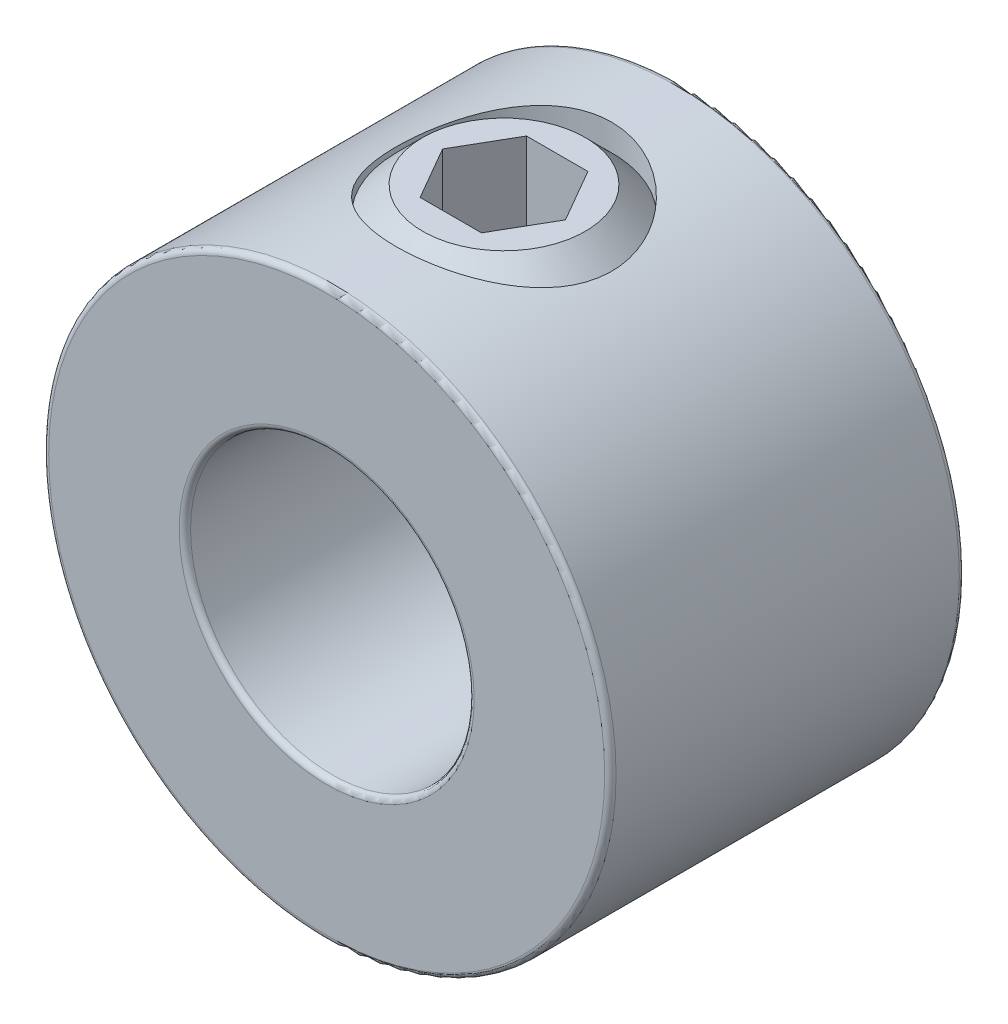
ISO-10303-21;
HEADER;
FILE_DESCRIPTION(('STEP AP214'),'2;1');
FILE_NAME('part.step','',(''),(''),'','','');
FILE_SCHEMA(('AUTOMOTIVE_DESIGN { 1 0 10303 214 1 1 1 1 }'));
ENDSEC;
DATA;
#1=APPLICATION_CONTEXT('core data for automotive mechanical design processes');
#2=APPLICATION_PROTOCOL_DEFINITION('international standard','automotive_design',2000,#1);
#3=PRODUCT_CONTEXT('',#1,'mechanical');
#4=PRODUCT('Part','Part','',(#3));
#5=PRODUCT_RELATED_PRODUCT_CATEGORY('part','',(#4));
#6=PRODUCT_DEFINITION_FORMATION('','',#4);
#7=PRODUCT_DEFINITION_CONTEXT('part definition',#1,'design');
#8=PRODUCT_DEFINITION('design','',#6,#7);
#9=PRODUCT_DEFINITION_SHAPE('','',#8);
#10=(LENGTH_UNIT() NAMED_UNIT(*) SI_UNIT(.MILLI.,.METRE.));
#11=(NAMED_UNIT(*) PLANE_ANGLE_UNIT() SI_UNIT($,.RADIAN.));
#12=(NAMED_UNIT(*) SI_UNIT($,.STERADIAN.) SOLID_ANGLE_UNIT());
#13=UNCERTAINTY_MEASURE_WITH_UNIT(LENGTH_MEASURE(1.E-05),#10,'distance_accuracy_value','');
#14=(GEOMETRIC_REPRESENTATION_CONTEXT(3) GLOBAL_UNCERTAINTY_ASSIGNED_CONTEXT((#13)) GLOBAL_UNIT_ASSIGNED_CONTEXT((#10,
#11,#12)) REPRESENTATION_CONTEXT('',''));
#15=CARTESIAN_POINT('',(0.,0.,0.));
#16=DIRECTION('',(0.,0.,1.));
#17=DIRECTION('',(1.,0.,0.));
#18=AXIS2_PLACEMENT_3D('',#15,#16,#17);
#19=CARTESIAN_POINT('',(0.,6.35,0.));
#20=DIRECTION('',(0.,1.,0.));
#21=DIRECTION('',(-1.,0.,0.));
#22=AXIS2_PLACEMENT_3D('',#19,#20,#21);
#23=PLANE('',#22);
#24=CARTESIAN_POINT('',(0.,6.35,0.));
#25=DIRECTION('',(0.,1.,0.));
#26=DIRECTION('',(-1.,0.,0.));
#27=AXIS2_PLACEMENT_3D('',#24,#25,#26);
#28=CIRCLE('',#27,1.81975161629017);
#29=CARTESIAN_POINT('',(-1.81975161629017,6.35,0.));
#30=VERTEX_POINT('',#29);
#31=EDGE_CURVE('E12',#30,#30,#28,.T.);
#32=ORIENTED_EDGE('',*,*,#31,.T.);
#33=EDGE_LOOP('',(#32));
#34=FACE_BOUND('',#33,.T.);
#35=DIRECTION('',(1.,0.,0.));
#36=VECTOR('',#35,1.);
#37=CARTESIAN_POINT('',(-0.687407664253898,6.34999999999999,-1.190625));
#38=LINE('',#37,#36);
#39=CARTESIAN_POINT('',(-0.687407664253898,6.34999999999999,-1.190625));
#40=VERTEX_POINT('',#39);
#41=CARTESIAN_POINT('',(0.687407664253898,6.35,-1.190625));
#42=VERTEX_POINT('',#41);
#43=EDGE_CURVE('E115',#40,#42,#38,.T.);
#44=ORIENTED_EDGE('',*,*,#43,.T.);
#45=DIRECTION('',(0.5,0.,0.866025403784439));
#46=VECTOR('',#45,1.);
#47=CARTESIAN_POINT('',(0.687407664253898,6.34999999999999,-1.190625));
#48=LINE('',#47,#46);
#49=CARTESIAN_POINT('',(1.3748153285078,6.34999999999999,0.));
#50=VERTEX_POINT('',#49);
#51=EDGE_CURVE('E61',#42,#50,#48,.T.);
#52=ORIENTED_EDGE('',*,*,#51,.T.);
#53=DIRECTION('',(-0.5,0.,0.866025403784439));
#54=VECTOR('',#53,1.);
#55=CARTESIAN_POINT('',(1.3748153285078,6.34999999999999,0.));
#56=LINE('',#55,#54);
#57=CARTESIAN_POINT('',(0.687407664253899,6.34999999999999,1.190625));
#58=VERTEX_POINT('',#57);
#59=EDGE_CURVE('E119',#50,#58,#56,.T.);
#60=ORIENTED_EDGE('',*,*,#59,.T.);
#61=DIRECTION('',(-1.,0.,0.));
#62=VECTOR('',#61,1.);
#63=CARTESIAN_POINT('',(0.687407664253899,6.34999999999999,1.190625));
#64=LINE('',#63,#62);
#65=CARTESIAN_POINT('',(-0.687407664253899,6.34999999999999,1.190625));
#66=VERTEX_POINT('',#65);
#67=EDGE_CURVE('E182',#58,#66,#64,.T.);
#68=ORIENTED_EDGE('',*,*,#67,.T.);
#69=DIRECTION('',(-0.5,0.,-0.866025403784439));
#70=VECTOR('',#69,1.);
#71=CARTESIAN_POINT('',(-0.687407664253899,6.34999999999999,1.190625));
#72=LINE('',#71,#70);
#73=CARTESIAN_POINT('',(-1.3748153285078,6.34999999999999,0.));
#74=VERTEX_POINT('',#73);
#75=EDGE_CURVE('E167',#66,#74,#72,.T.);
#76=ORIENTED_EDGE('',*,*,#75,.T.);
#77=DIRECTION('',(0.5,0.,-0.866025403784439));
#78=VECTOR('',#77,1.);
#79=CARTESIAN_POINT('',(-1.3748153285078,6.34999999999999,0.));
#80=LINE('',#79,#78);
#81=EDGE_CURVE('E163',#74,#40,#80,.T.);
#82=ORIENTED_EDGE('',*,*,#81,.T.);
#83=EDGE_LOOP('',(#44,#52,#60,#68,#76,#82));
#84=FACE_BOUND('',#83,.T.);
#85=ADVANCED_FACE('F47',(#34,#84),#23,.T.);
#86=CARTESIAN_POINT('',(0.,6.35,0.));
#87=DIRECTION('',(0.,-1.,0.));
#88=DIRECTION('',(1.,0.,0.));
#89=AXIS2_PLACEMENT_3D('',#86,#87,#88);
#90=CONICAL_SURFACE('',#89,1.81975161629017,0.785398163397448);
#91=CARTESIAN_POINT('',(0.,5.75675161629017,0.));
#92=DIRECTION('',(0.,1.,0.));
#93=DIRECTION('',(-1.,0.,0.));
#94=AXIS2_PLACEMENT_3D('',#91,#92,#93);
#95=CIRCLE('',#94,2.413);
#96=CARTESIAN_POINT('',(-2.413,5.75675161629017,0.));
#97=VERTEX_POINT('',#96);
#98=EDGE_CURVE('E54',#97,#97,#95,.T.);
#99=ORIENTED_EDGE('',*,*,#98,.T.);
#100=EDGE_LOOP('',(#99));
#101=FACE_BOUND('',#100,.T.);
#102=ORIENTED_EDGE('',*,*,#31,.F.);
#103=EDGE_LOOP('',(#102));
#104=FACE_BOUND('',#103,.T.);
#105=ADVANCED_FACE('F137',(#101,#104),#90,.T.);
#106=CARTESIAN_POINT('',(0.,3.175,0.));
#107=DIRECTION('',(0.,1.,0.));
#108=DIRECTION('',(-1.,0.,0.));
#109=AXIS2_PLACEMENT_3D('',#106,#107,#108);
#110=CYLINDRICAL_SURFACE('',#109,2.413);
#111=CARTESIAN_POINT('',(0.,3.76824838370983,0.));
#112=DIRECTION('',(0.,1.,0.));
#113=DIRECTION('',(-1.,0.,0.));
#114=AXIS2_PLACEMENT_3D('',#111,#112,#113);
#115=CIRCLE('',#114,2.413);
#116=CARTESIAN_POINT('',(-2.413,3.76824838370983,0.));
#117=VERTEX_POINT('',#116);
#118=EDGE_CURVE('E132',#117,#117,#115,.T.);
#119=ORIENTED_EDGE('',*,*,#118,.T.);
#120=EDGE_LOOP('',(#119));
#121=FACE_BOUND('',#120,.T.);
#122=ORIENTED_EDGE('',*,*,#98,.F.);
#123=EDGE_LOOP('',(#122));
#124=FACE_BOUND('',#123,.T.);
#125=ADVANCED_FACE('F140',(#121,#124),#110,.T.);
#126=CARTESIAN_POINT('',(0.,3.76824838370983,0.));
#127=DIRECTION('',(0.,1.,0.));
#128=DIRECTION('',(-1.,0.,0.));
#129=AXIS2_PLACEMENT_3D('',#126,#127,#128);
#130=CONICAL_SURFACE('',#129,2.413,0.785398163397449);
#131=CARTESIAN_POINT('',(0.,3.175,0.));
#132=DIRECTION('',(0.,1.,0.));
#133=DIRECTION('',(-1.,0.,0.));
#134=AXIS2_PLACEMENT_3D('',#131,#132,#133);
#135=CIRCLE('',#134,1.81975161629017);
#136=CARTESIAN_POINT('',(-1.81975161629017,3.175,0.));
#137=VERTEX_POINT('',#136);
#138=EDGE_CURVE('E124',#137,#137,#135,.T.);
#139=ORIENTED_EDGE('',*,*,#138,.T.);
#140=EDGE_LOOP('',(#139));
#141=FACE_BOUND('',#140,.T.);
#142=ORIENTED_EDGE('',*,*,#118,.F.);
#143=EDGE_LOOP('',(#142));
#144=FACE_BOUND('',#143,.T.);
#145=ADVANCED_FACE('F142',(#141,#144),#130,.T.);
#146=CARTESIAN_POINT('',(-1.81975161629017,3.175,0.));
#147=DIRECTION('',(0.,-1.,0.));
#148=DIRECTION('',(1.,0.,0.));
#149=AXIS2_PLACEMENT_3D('',#146,#147,#148);
#150=PLANE('',#149);
#151=CARTESIAN_POINT('',(0.,3.175,0.));
#152=DIRECTION('',(0.,1.,0.));
#153=DIRECTION('',(-1.,0.,0.));
#154=AXIS2_PLACEMENT_3D('',#151,#152,#153);
#155=CIRCLE('',#154,0.711898060451797);
#156=CARTESIAN_POINT('',(-0.711898060451796,3.175,0.));
#157=VERTEX_POINT('',#156);
#158=EDGE_CURVE('E120',#157,#157,#155,.T.);
#159=ORIENTED_EDGE('',*,*,#158,.T.);
#160=EDGE_LOOP('',(#159));
#161=FACE_BOUND('',#160,.T.);
#162=ORIENTED_EDGE('',*,*,#138,.F.);
#163=EDGE_LOOP('',(#162));
#164=FACE_BOUND('',#163,.T.);
#165=ADVANCED_FACE('F149',(#161,#164),#150,.T.);
#166=CARTESIAN_POINT('',(0.,3.175,0.));
#167=DIRECTION('',(0.,-1.,0.));
#168=DIRECTION('',(1.,0.,0.));
#169=AXIS2_PLACEMENT_3D('',#166,#167,#168);
#170=CONICAL_SURFACE('',#169,0.711898060451797,0.785398163397448);
#171=CARTESIAN_POINT('',(0.,3.8868980604518,0.));
#172=VERTEX_POINT('',#171);
#173=VERTEX_LOOP('',#172);
#174=FACE_BOUND('',#173,.T.);
#175=ORIENTED_EDGE('',*,*,#158,.F.);
#176=EDGE_LOOP('',(#175));
#177=FACE_BOUND('',#176,.T.);
#178=ADVANCED_FACE('F216',(#174,#177),#170,.F.);
#179=CARTESIAN_POINT('',(0.687407664253898,3.96874999999999,-1.190625));
#180=DIRECTION('',(-0.866025403784439,0.,0.5));
#181=DIRECTION('',(0.5,0.,0.866025403784438));
#182=AXIS2_PLACEMENT_3D('',#179,#180,#181);
#183=PLANE('',#182);
#184=ORIENTED_EDGE('',*,*,#51,.F.);
#185=DIRECTION('',(0.,1.,0.));
#186=VECTOR('',#185,1.);
#187=CARTESIAN_POINT('',(0.687407664253898,3.96874999999999,-1.190625));
#188=LINE('',#187,#186);
#189=CARTESIAN_POINT('',(0.687407664253898,3.96874999999999,-1.190625));
#190=VERTEX_POINT('',#189);
#191=EDGE_CURVE('E114',#190,#42,#188,.T.);
#192=ORIENTED_EDGE('',*,*,#191,.F.);
#193=DIRECTION('',(0.5,0.,0.866025403784439));
#194=VECTOR('',#193,1.);
#195=CARTESIAN_POINT('',(0.687407664253898,3.96874999999999,-1.190625));
#196=LINE('',#195,#194);
#197=CARTESIAN_POINT('',(1.3748153285078,3.96874999999999,0.));
#198=VERTEX_POINT('',#197);
#199=EDGE_CURVE('E105',#190,#198,#196,.T.);
#200=ORIENTED_EDGE('',*,*,#199,.T.);
#201=DIRECTION('',(0.,1.,0.));
#202=VECTOR('',#201,1.);
#203=CARTESIAN_POINT('',(1.3748153285078,3.96874999999999,0.));
#204=LINE('',#203,#202);
#205=EDGE_CURVE('E113',#198,#50,#204,.T.);
#206=ORIENTED_EDGE('',*,*,#205,.T.);
#207=EDGE_LOOP('',(#184,#192,#200,#206));
#208=FACE_BOUND('',#207,.T.);
#209=ADVANCED_FACE('F112',(#208),#183,.T.);
#210=CARTESIAN_POINT('',(1.3748153285078,3.96874999999999,0.));
#211=DIRECTION('',(-0.866025403784439,0.,-0.5));
#212=DIRECTION('',(-0.5,0.,0.866025403784439));
#213=AXIS2_PLACEMENT_3D('',#210,#211,#212);
#214=PLANE('',#213);
#215=ORIENTED_EDGE('',*,*,#59,.F.);
#216=ORIENTED_EDGE('',*,*,#205,.F.);
#217=DIRECTION('',(-0.5,0.,0.866025403784439));
#218=VECTOR('',#217,1.);
#219=CARTESIAN_POINT('',(1.3748153285078,3.96874999999999,0.));
#220=LINE('',#219,#218);
#221=CARTESIAN_POINT('',(0.687407664253899,3.96874999999999,1.190625));
#222=VERTEX_POINT('',#221);
#223=EDGE_CURVE('E101',#198,#222,#220,.T.);
#224=ORIENTED_EDGE('',*,*,#223,.T.);
#225=DIRECTION('',(0.,1.,0.));
#226=VECTOR('',#225,1.);
#227=CARTESIAN_POINT('',(0.687407664253899,3.96874999999999,1.190625));
#228=LINE('',#227,#226);
#229=EDGE_CURVE('E121',#222,#58,#228,.T.);
#230=ORIENTED_EDGE('',*,*,#229,.T.);
#231=EDGE_LOOP('',(#215,#216,#224,#230));
#232=FACE_BOUND('',#231,.T.);
#233=ADVANCED_FACE('F117',(#232),#214,.T.);
#234=CARTESIAN_POINT('',(0.687407664253899,3.96874999999999,1.190625));
#235=DIRECTION('',(0.,0.,-1.));
#236=DIRECTION('',(-1.,0.,0.));
#237=AXIS2_PLACEMENT_3D('',#234,#235,#236);
#238=PLANE('',#237);
#239=ORIENTED_EDGE('',*,*,#67,.F.);
#240=ORIENTED_EDGE('',*,*,#229,.F.);
#241=DIRECTION('',(-1.,0.,0.));
#242=VECTOR('',#241,1.);
#243=CARTESIAN_POINT('',(0.687407664253899,3.96874999999999,1.190625));
#244=LINE('',#243,#242);
#245=CARTESIAN_POINT('',(-0.687407664253899,3.96874999999999,1.190625));
#246=VERTEX_POINT('',#245);
#247=EDGE_CURVE('E107',#222,#246,#244,.T.);
#248=ORIENTED_EDGE('',*,*,#247,.T.);
#249=DIRECTION('',(0.,1.,0.));
#250=VECTOR('',#249,1.);
#251=CARTESIAN_POINT('',(-0.687407664253899,3.96874999999999,1.190625));
#252=LINE('',#251,#250);
#253=EDGE_CURVE('E126',#246,#66,#252,.T.);
#254=ORIENTED_EDGE('',*,*,#253,.T.);
#255=EDGE_LOOP('',(#239,#240,#248,#254));
#256=FACE_BOUND('',#255,.T.);
#257=ADVANCED_FACE('F180',(#256),#238,.T.);
#258=CARTESIAN_POINT('',(-0.687407664253899,3.96874999999999,1.190625));
#259=DIRECTION('',(0.866025403784439,0.,-0.5));
#260=DIRECTION('',(-0.5,0.,-0.866025403784439));
#261=AXIS2_PLACEMENT_3D('',#258,#259,#260);
#262=PLANE('',#261);
#263=ORIENTED_EDGE('',*,*,#75,.F.);
#264=ORIENTED_EDGE('',*,*,#253,.F.);
#265=DIRECTION('',(-0.5,0.,-0.866025403784439));
#266=VECTOR('',#265,1.);
#267=CARTESIAN_POINT('',(-0.687407664253899,3.96874999999999,1.190625));
#268=LINE('',#267,#266);
#269=CARTESIAN_POINT('',(-1.3748153285078,3.96874999999999,0.));
#270=VERTEX_POINT('',#269);
#271=EDGE_CURVE('E193',#246,#270,#268,.T.);
#272=ORIENTED_EDGE('',*,*,#271,.T.);
#273=DIRECTION('',(0.,1.,0.));
#274=VECTOR('',#273,1.);
#275=CARTESIAN_POINT('',(-1.3748153285078,3.96874999999999,0.));
#276=LINE('',#275,#274);
#277=EDGE_CURVE('E175',#270,#74,#276,.T.);
#278=ORIENTED_EDGE('',*,*,#277,.T.);
#279=EDGE_LOOP('',(#263,#264,#272,#278));
#280=FACE_BOUND('',#279,.T.);
#281=ADVANCED_FACE('F184',(#280),#262,.T.);
#282=CARTESIAN_POINT('',(-1.3748153285078,3.96874999999999,0.));
#283=DIRECTION('',(0.866025403784439,0.,0.5));
#284=DIRECTION('',(0.5,0.,-0.866025403784439));
#285=AXIS2_PLACEMENT_3D('',#282,#283,#284);
#286=PLANE('',#285);
#287=ORIENTED_EDGE('',*,*,#81,.F.);
#288=ORIENTED_EDGE('',*,*,#277,.F.);
#289=DIRECTION('',(0.5,0.,-0.866025403784439));
#290=VECTOR('',#289,1.);
#291=CARTESIAN_POINT('',(-1.3748153285078,3.96874999999999,0.));
#292=LINE('',#291,#290);
#293=CARTESIAN_POINT('',(-0.687407664253898,3.96874999999999,-1.190625));
#294=VERTEX_POINT('',#293);
#295=EDGE_CURVE('E191',#270,#294,#292,.T.);
#296=ORIENTED_EDGE('',*,*,#295,.T.);
#297=DIRECTION('',(0.,1.,0.));
#298=VECTOR('',#297,1.);
#299=CARTESIAN_POINT('',(-0.687407664253898,3.96874999999999,-1.190625));
#300=LINE('',#299,#298);
#301=EDGE_CURVE('E172',#294,#40,#300,.T.);
#302=ORIENTED_EDGE('',*,*,#301,.T.);
#303=EDGE_LOOP('',(#287,#288,#296,#302));
#304=FACE_BOUND('',#303,.T.);
#305=ADVANCED_FACE('F197',(#304),#286,.T.);
#306=CARTESIAN_POINT('',(-0.687407664253898,3.96874999999999,-1.190625));
#307=DIRECTION('',(0.,0.,1.));
#308=DIRECTION('',(1.,0.,0.));
#309=AXIS2_PLACEMENT_3D('',#306,#307,#308);
#310=PLANE('',#309);
#311=ORIENTED_EDGE('',*,*,#43,.F.);
#312=ORIENTED_EDGE('',*,*,#301,.F.);
#313=DIRECTION('',(1.,0.,0.));
#314=VECTOR('',#313,1.);
#315=CARTESIAN_POINT('',(-0.687407664253898,3.96874999999999,-1.190625));
#316=LINE('',#315,#314);
#317=EDGE_CURVE('E173',#294,#190,#316,.T.);
#318=ORIENTED_EDGE('',*,*,#317,.T.);
#319=ORIENTED_EDGE('',*,*,#191,.T.);
#320=EDGE_LOOP('',(#311,#312,#318,#319));
#321=FACE_BOUND('',#320,.T.);
#322=ADVANCED_FACE('F198',(#321),#310,.T.);
#323=CARTESIAN_POINT('',(0.687407664253898,3.96874999999999,-1.190625));
#324=DIRECTION('',(0.,1.,0.));
#325=DIRECTION('',(0.,0.,1.));
#326=AXIS2_PLACEMENT_3D('',#323,#324,#325);
#327=PLANE('',#326);
#328=ORIENTED_EDGE('',*,*,#199,.F.);
#329=ORIENTED_EDGE('',*,*,#317,.F.);
#330=ORIENTED_EDGE('',*,*,#295,.F.);
#331=ORIENTED_EDGE('',*,*,#271,.F.);
#332=ORIENTED_EDGE('',*,*,#247,.F.);
#333=ORIENTED_EDGE('',*,*,#223,.F.);
#334=EDGE_LOOP('',(#328,#329,#330,#331,#332,#333));
#335=FACE_BOUND('',#334,.T.);
#336=ADVANCED_FACE('F103',(#335),#327,.T.);
#337=CLOSED_SHELL('',(#85,#105,#125,#145,#165,#178,#209,#233,#257,#281,#305,#322,#336));
#338=MANIFOLD_SOLID_BREP('B2',#337);
#339=CARTESIAN_POINT('',(0.,0.,3.96875));
#340=DIRECTION('',(0.,0.,1.));
#341=DIRECTION('',(1.,0.,0.));
#342=AXIS2_PLACEMENT_3D('',#339,#340,#341);
#343=PLANE('',#342);
#344=CARTESIAN_POINT('',(0.,0.,3.96875));
#345=DIRECTION('',(0.,0.,1.));
#346=DIRECTION('',(1.,0.,0.));
#347=AXIS2_PLACEMENT_3D('',#344,#345,#346);
#348=CIRCLE('',#347,3.302);
#349=CARTESIAN_POINT('',(3.302,0.,3.96875));
#350=VERTEX_POINT('',#349);
#351=EDGE_CURVE('E312',#350,#350,#348,.F.);
#352=ORIENTED_EDGE('',*,*,#351,.T.);
#353=EDGE_LOOP('',(#352));
#354=FACE_BOUND('',#353,.T.);
#355=CARTESIAN_POINT('',(0.,0.,3.96875));
#356=DIRECTION('',(0.,0.,1.));
#357=DIRECTION('',(1.,0.,0.));
#358=AXIS2_PLACEMENT_3D('',#355,#356,#357);
#359=CIRCLE('',#358,6.223);
#360=CARTESIAN_POINT('',(6.223,0.,3.96875));
#361=VERTEX_POINT('',#360);
#362=EDGE_CURVE('E316',#361,#361,#359,.T.);
#363=ORIENTED_EDGE('',*,*,#362,.T.);
#364=EDGE_LOOP('',(#363));
#365=FACE_BOUND('',#364,.T.);
#366=ADVANCED_FACE('F301',(#354,#365),#343,.T.);
#367=CARTESIAN_POINT('',(0.,0.,-3.96875));
#368=DIRECTION('',(0.,0.,1.));
#369=DIRECTION('',(1.,0.,0.));
#370=AXIS2_PLACEMENT_3D('',#367,#368,#369);
#371=PLANE('',#370);
#372=CARTESIAN_POINT('',(0.,0.,-3.96875));
#373=DIRECTION('',(0.,0.,1.));
#374=DIRECTION('',(1.,0.,0.));
#375=AXIS2_PLACEMENT_3D('',#372,#373,#374);
#376=CIRCLE('',#375,3.302);
#377=CARTESIAN_POINT('',(3.302,0.,-3.96875));
#378=VERTEX_POINT('',#377);
#379=EDGE_CURVE('E327',#378,#378,#376,.T.);
#380=ORIENTED_EDGE('',*,*,#379,.T.);
#381=EDGE_LOOP('',(#380));
#382=FACE_BOUND('',#381,.T.);
#383=CARTESIAN_POINT('',(0.,0.,-3.96875));
#384=DIRECTION('',(0.,0.,1.));
#385=DIRECTION('',(1.,0.,0.));
#386=AXIS2_PLACEMENT_3D('',#383,#384,#385);
#387=CIRCLE('',#386,6.223);
#388=CARTESIAN_POINT('',(6.223,0.,-3.96875));
#389=VERTEX_POINT('',#388);
#390=EDGE_CURVE('E330',#389,#389,#387,.F.);
#391=ORIENTED_EDGE('',*,*,#390,.T.);
#392=EDGE_LOOP('',(#391));
#393=FACE_BOUND('',#392,.T.);
#394=ADVANCED_FACE('F366',(#382,#393),#371,.F.);
#395=CARTESIAN_POINT('',(0.,0.,3.96875));
#396=DIRECTION('',(0.,0.,-1.));
#397=DIRECTION('',(-1.,0.,0.));
#398=AXIS2_PLACEMENT_3D('',#395,#396,#397);
#399=CYLINDRICAL_SURFACE('',#398,6.35);
#400=CARTESIAN_POINT('',(0.,0.,-3.84175));
#401=DIRECTION('',(0.,0.,1.));
#402=DIRECTION('',(1.,0.,0.));
#403=AXIS2_PLACEMENT_3D('',#400,#401,#402);
#404=CIRCLE('',#403,6.35);
#405=CARTESIAN_POINT('',(6.35,0.,-3.84175));
#406=VERTEX_POINT('',#405);
#407=EDGE_CURVE('E46',#406,#406,#404,.T.);
#408=ORIENTED_EDGE('',*,*,#407,.T.);
#409=EDGE_LOOP('',(#408));
#410=FACE_BOUND('',#409,.T.);
#411=CARTESIAN_POINT('',(0.,0.,3.84175));
#412=DIRECTION('',(0.,0.,1.));
#413=DIRECTION('',(1.,0.,0.));
#414=AXIS2_PLACEMENT_3D('',#411,#412,#413);
#415=CIRCLE('',#414,6.35);
#416=CARTESIAN_POINT('',(6.35,0.,3.84175));
#417=VERTEX_POINT('',#416);
#418=EDGE_CURVE('E308',#417,#417,#415,.F.);
#419=ORIENTED_EDGE('',*,*,#418,.T.);
#420=EDGE_LOOP('',(#419));
#421=FACE_BOUND('',#420,.T.);
#422=CARTESIAN_POINT('',(0.,6.35,-2.413));
#423=CARTESIAN_POINT('',(0.130555931467962,6.35000398969011,-2.41300527534602));
#424=CARTESIAN_POINT('',(0.261076241377739,6.34593890816647,-2.4023714543113));
#425=CARTESIAN_POINT('',(0.518209446534913,6.33012963929965,-2.36029479676423));
#426=CARTESIAN_POINT('',(0.644823015088655,6.31838678300935,-2.32885556715778));
#427=CARTESIAN_POINT('',(0.890396734122701,6.28848040494,-2.24644511602075));
#428=CARTESIAN_POINT('',(1.00937135935963,6.27032947705095,-2.19551218938446));
#429=CARTESIAN_POINT('',(1.23707694907279,6.22940932060409,-2.07575764561934));
#430=CARTESIAN_POINT('',(1.34580507871092,6.20663881943741,-2.00693109764769));
#431=CARTESIAN_POINT('',(1.5546544090621,6.15771932779737,-1.85022277092613));
#432=CARTESIAN_POINT('',(1.65427192875035,6.13147296383124,-1.76170041624995));
#433=CARTESIAN_POINT('',(1.83765571561736,6.07903240405007,-1.56947315042905));
#434=CARTESIAN_POINT('',(1.92141693988139,6.05283822744466,-1.46576342765122));
#435=CARTESIAN_POINT('',(2.07395660623911,6.00232668170519,-1.24113386470124));
#436=CARTESIAN_POINT('',(2.14201618015845,5.97812365120729,-1.11969756154783));
#437=CARTESIAN_POINT('',(2.25652093858858,5.93585432476053,-0.866038380432351));
#438=CARTESIAN_POINT('',(2.30297502037546,5.91778550353544,-0.733819969020803));
#439=CARTESIAN_POINT('',(2.37094947712185,5.89087364983883,-0.46815363189803));
#440=CARTESIAN_POINT('',(2.39343294050412,5.88167580744491,-0.334989300795486));
#441=CARTESIAN_POINT('',(2.41583880524757,5.87251090464605,-0.0664845962936197));
#442=CARTESIAN_POINT('',(2.41577084821779,5.87253989940926,0.0688548224232351));
#443=CARTESIAN_POINT('',(2.39381090108878,5.88152011871453,0.328972227003014));
#444=CARTESIAN_POINT('',(2.37326609797153,5.88992057372023,0.453886522563246));
#445=CARTESIAN_POINT('',(2.31316652422954,5.91378008823147,0.698339704990829));
#446=CARTESIAN_POINT('',(2.27360881167116,5.92924024008996,0.817877756841903));
#447=CARTESIAN_POINT('',(2.17588364092748,5.96580146890692,1.0508916152852));
#448=CARTESIAN_POINT('',(2.11737290423754,5.98700531598431,1.16420661484106));
#449=CARTESIAN_POINT('',(1.98364217411328,6.03263175509447,1.37979639920587));
#450=CARTESIAN_POINT('',(1.90841630395244,6.05705547794376,1.4820672822727));
#451=CARTESIAN_POINT('',(1.73726689770536,6.10842961274997,1.68010694238863));
#452=CARTESIAN_POINT('',(1.64027173491613,6.13543795015635,1.77493688260015));
#453=CARTESIAN_POINT('',(1.43144868882472,6.18748920351012,1.94726806056401));
#454=CARTESIAN_POINT('',(1.31961840653187,6.2125318005324,2.02476649017818));
#455=CARTESIAN_POINT('',(1.08185265975391,6.25835188225341,2.16130771487283));
#456=CARTESIAN_POINT('',(0.955717417234618,6.27905339803369,2.22002994310971));
#457=CARTESIAN_POINT('',(0.694375189035109,6.31329326294077,2.31510736575226));
#458=CARTESIAN_POINT('',(0.559172376611221,6.32683488218724,2.3514727723643));
#459=CARTESIAN_POINT('',(0.291428150212525,6.3446501972992,2.39898109857718));
#460=CARTESIAN_POINT('',(0.159141645079808,6.34938771868047,2.41138775288999));
#461=CARTESIAN_POINT('',(-0.105693065348276,6.35049981057155,2.41431626348443));
#462=CARTESIAN_POINT('',(-0.238241203822052,6.34687629478166,2.40484312768025));
#463=CARTESIAN_POINT('',(-0.494323602805378,6.33197908606406,2.36523562382545));
#464=CARTESIAN_POINT('',(-0.61800684441211,6.32101461634214,2.33593589818825));
#465=CARTESIAN_POINT('',(-0.858609565436108,6.29285092848222,2.25861304376362));
#466=CARTESIAN_POINT('',(-0.975528163914414,6.27565090041604,2.21058748264173));
#467=CARTESIAN_POINT('',(-1.20317276582384,6.23607457125026,2.09563503714011));
#468=CARTESIAN_POINT('',(-1.3136121499673,6.21355984396609,2.02818967610491));
#469=CARTESIAN_POINT('',(-1.52197988578177,6.16583504517286,1.87689595883598));
#470=CARTESIAN_POINT('',(-1.61990351002366,6.14062396176678,1.79304143465584));
#471=CARTESIAN_POINT('',(-1.80656807112922,6.08841217199752,1.60543272496061));
#472=CARTESIAN_POINT('',(-1.89441393314817,6.06139435477813,1.5007904098217));
#473=CARTESIAN_POINT('',(-2.05148411432654,6.01005496187559,1.27772800811267));
#474=CARTESIAN_POINT('',(-2.12070651399853,5.98573366426972,1.15930650314625));
#475=CARTESIAN_POINT('',(-2.23870023772464,5.94261798623815,0.910922748538602));
#476=CARTESIAN_POINT('',(-2.28736466342468,5.92385264334907,0.780904332023381));
#477=CARTESIAN_POINT('',(-2.36177800946808,5.89458517077402,0.513602694331982));
#478=CARTESIAN_POINT('',(-2.38754162954713,5.8840777409413,0.376324193363579));
#479=CARTESIAN_POINT('',(-2.41408994040532,5.87323215610138,0.108127165215383));
#480=CARTESIAN_POINT('',(-2.41640623148607,5.87227054588007,-0.0226157343841075));
#481=CARTESIAN_POINT('',(-2.3999373204655,5.8790202253426,-0.282524873396556));
#482=CARTESIAN_POINT('',(-2.38115423316032,5.88673064582666,-0.41169126951125));
#483=CARTESIAN_POINT('',(-2.32422421188573,5.90943043237583,-0.660552265849344));
#484=CARTESIAN_POINT('',(-2.28672002796391,5.92417751295514,-0.780417919491674));
#485=CARTESIAN_POINT('',(-2.19398528189399,5.95914188552999,-1.01222145618602));
#486=CARTESIAN_POINT('',(-2.13875018285588,5.97936057736356,-1.12415730124382));
#487=CARTESIAN_POINT('',(-2.00869997639504,6.02433337271119,-1.34342800575803));
#488=CARTESIAN_POINT('',(-1.93299650808671,6.04927206356278,-1.4501976241717));
#489=CARTESIAN_POINT('',(-1.76551836882645,6.10025417003155,-1.65000619367226));
#490=CARTESIAN_POINT('',(-1.67373852090438,6.12629793945648,-1.74304070389426));
#491=CARTESIAN_POINT('',(-1.47055494697206,6.17831294001547,-1.91807209951937));
#492=CARTESIAN_POINT('',(-1.35833856072122,6.20419794006484,-1.99915556641372));
#493=CARTESIAN_POINT('',(-1.12096041375387,6.25144642675378,-2.14129762074769));
#494=CARTESIAN_POINT('',(-0.995797050693124,6.27280935273315,-2.20235372565052));
#495=CARTESIAN_POINT('',(-0.728778395788011,6.30955475572144,-2.30499263616226));
#496=CARTESIAN_POINT('',(-0.58638469778337,6.32454657619379,-2.3453288052365));
#497=CARTESIAN_POINT('',(-0.295976705251577,6.34476431329028,-2.39932232882264));
#498=CARTESIAN_POINT('',(-0.147965475024477,6.34999547828747,-2.41299402119021));
#499=CARTESIAN_POINT('',(0.,6.35,-2.413));
#500=B_SPLINE_CURVE_WITH_KNOTS('',3,(#422,#423,#424,#425,#426,#427,#428,#429,#430,#431,#432,
#433,#434,#435,#436,#437,#438,#439,#440,#441,#442,#443,#444,#445,#446,#447,#448,#449,#450,#451,
#452,#453,#454,#455,#456,#457,#458,#459,#460,#461,#462,#463,#464,#465,#466,#467,#468,#469,#470,
#471,#472,#473,#474,#475,#476,#477,#478,#479,#480,#481,#482,#483,#484,#485,#486,#487,#488,#489,
#490,#491,#492,#493,#494,#495,#496,#497,#498,#499),.UNSPECIFIED.,.T.,.F.,(4,2,2,2,2,2,2,2,2,2,2,
2,2,2,2,2,2,2,2,2,2,2,2,2,2,2,2,2,2,2,2,2,2,2,2,2,2,2,4),(0.,0.391121887064184,
0.782175985486185,1.17246577830223,1.56286323524963,1.96854634212709,2.37435825594016,
2.79613130529395,3.21773051175688,3.62166628723491,4.02542936468621,4.40427313209371,
4.78317553819666,5.16936515238192,5.55569075901495,5.96873424705112,6.38184461005431,
6.80167192308661,7.22130732355892,7.61812936188612,8.01486058335588,8.39585156202364,
8.77689204483065,9.16923685274999,9.56172942118012,9.9776135359701,10.3935404987953,
10.8116043631128,11.2293996833676,11.6197130905881,12.0099873800853,12.3876994067832,
12.7655081575183,13.1635000328781,13.5616203073395,13.9821012344605,14.4026342635628,
14.8461505355472,15.2894282569131),.UNSPECIFIED.);
#501=CARTESIAN_POINT('',(0.,6.35,-2.413));
#502=VERTEX_POINT('',#501);
#503=EDGE_CURVE('E333',#502,#502,#500,.T.);
#504=ORIENTED_EDGE('',*,*,#503,.T.);
#505=EDGE_LOOP('',(#504));
#506=FACE_BOUND('',#505,.T.);
#507=ADVANCED_FACE('F362',(#410,#421,#506),#399,.T.);
#508=CARTESIAN_POINT('',(0.,0.,3.96875));
#509=DIRECTION('',(0.,0.,-1.));
#510=DIRECTION('',(-1.,0.,0.));
#511=AXIS2_PLACEMENT_3D('',#508,#509,#510);
#512=CYLINDRICAL_SURFACE('',#511,3.175);
#513=CARTESIAN_POINT('',(0.,0.,-3.84175));
#514=DIRECTION('',(0.,0.,1.));
#515=DIRECTION('',(1.,0.,0.));
#516=AXIS2_PLACEMENT_3D('',#513,#514,#515);
#517=CIRCLE('',#516,3.175);
#518=CARTESIAN_POINT('',(3.175,0.,-3.84175));
#519=VERTEX_POINT('',#518);
#520=EDGE_CURVE('E321',#519,#519,#517,.F.);
#521=ORIENTED_EDGE('',*,*,#520,.T.);
#522=EDGE_LOOP('',(#521));
#523=FACE_BOUND('',#522,.T.);
#524=CARTESIAN_POINT('',(0.,0.,3.84175));
#525=DIRECTION('',(0.,0.,1.));
#526=DIRECTION('',(1.,0.,0.));
#527=AXIS2_PLACEMENT_3D('',#524,#525,#526);
#528=CIRCLE('',#527,3.175);
#529=CARTESIAN_POINT('',(3.175,0.,3.84175));
#530=VERTEX_POINT('',#529);
#531=EDGE_CURVE('E324',#530,#530,#528,.T.);
#532=ORIENTED_EDGE('',*,*,#531,.T.);
#533=EDGE_LOOP('',(#532));
#534=FACE_BOUND('',#533,.T.);
#535=CARTESIAN_POINT('',(0.,3.175,-2.413));
#536=CARTESIAN_POINT('',(0.117443171605231,3.17499092904906,-2.41299058031907));
#537=CARTESIAN_POINT('',(0.23503818841931,3.16841692674332,-2.4043581847269));
#538=CARTESIAN_POINT('',(0.466484967913331,3.14271336140829,-2.37038175457781));
#539=CARTESIAN_POINT('',(0.580328596183407,3.12355818632314,-2.34500362950094));
#540=CARTESIAN_POINT('',(0.80033693546367,3.07452724978738,-2.27928432631256));
#541=CARTESIAN_POINT('',(0.906543039514099,3.04471549355359,-2.23903243487973));
#542=CARTESIAN_POINT('',(1.10997011785933,2.97659455342082,-2.14548015839209));
#543=CARTESIAN_POINT('',(1.20719255384311,2.93828675533249,-2.09218190121579));
#544=CARTESIAN_POINT('',(1.40022726688529,2.85170030734834,-1.96882085307546));
#545=CARTESIAN_POINT('',(1.49506365463583,2.80282512985173,-1.89765858122501));
#546=CARTESIAN_POINT('',(1.67223382567996,2.7008760546092,-1.7435641158176));
#547=CARTESIAN_POINT('',(1.75454859398162,2.64779595363648,-1.66061438438314));
#548=CARTESIAN_POINT('',(1.92203888294129,2.5296135351956,-1.46565859240837));
#549=CARTESIAN_POINT('',(2.00423140536036,2.4643124367144,-1.35120048467098));
#550=CARTESIAN_POINT('',(2.14857118710811,2.33951215894306,-1.10735736644856));
#551=CARTESIAN_POINT('',(2.21074385995913,2.28000569136514,-0.977991565717825));
#552=CARTESIAN_POINT('',(2.29462037317499,2.19490180220151,-0.752497308608559));
#553=CARTESIAN_POINT('',(2.32287346332998,2.16472241167552,-0.66055827907226));
#554=CARTESIAN_POINT('',(2.36849823013454,2.11470881226284,-0.47139038700259));
#555=CARTESIAN_POINT('',(2.38589523743028,2.09485053921884,-0.374174418255039));
#556=CARTESIAN_POINT('',(2.40870358471578,2.06860028206587,-0.175460476777278));
#557=CARTESIAN_POINT('',(2.4139959431512,2.06234200752845,-0.073929905731699));
#558=CARTESIAN_POINT('',(2.41169213967819,2.06503422028968,0.128798184800726));
#559=CARTESIAN_POINT('',(2.40409306334661,2.07398814667793,0.22999562379254));
#560=CARTESIAN_POINT('',(2.37836508518799,2.10340433920656,0.416917246134645));
#561=CARTESIAN_POINT('',(2.36156171265492,2.1224091464969,0.503073429560243));
#562=CARTESIAN_POINT('',(2.31942910669347,2.16837457604816,0.671064962974234));
#563=CARTESIAN_POINT('',(2.29409116468348,2.19534332114491,0.752895800354834));
#564=CARTESIAN_POINT('',(2.21702947004233,2.27376916611904,0.962631680289748));
#565=CARTESIAN_POINT('',(2.15880606368402,2.32983777456744,1.08642083974007));
#566=CARTESIAN_POINT('',(2.0240584670168,2.44783368287627,1.32063556736185));
#567=CARTESIAN_POINT('',(1.94748865288627,2.50977535205404,1.43102676980356));
#568=CARTESIAN_POINT('',(1.77457755480707,2.63500191833982,1.64086400526623));
#569=CARTESIAN_POINT('',(1.67772908569284,2.69827393808612,1.73990181478264));
#570=CARTESIAN_POINT('',(1.46641465679805,2.81868720555883,1.92133244794249));
#571=CARTESIAN_POINT('',(1.35198192561174,2.87583967861316,2.00375600179513));
#572=CARTESIAN_POINT('',(1.1302184691796,2.96897239724258,2.13504920976438));
#573=CARTESIAN_POINT('',(1.02573469648465,3.00691100546587,2.18732233798596));
#574=CARTESIAN_POINT('',(0.807524498934965,3.07269924184988,2.27691743542351));
#575=CARTESIAN_POINT('',(0.693803632023793,3.10055488265641,2.31424831636675));
#576=CARTESIAN_POINT('',(0.458986561176873,3.14392869528766,2.37204565582169));
#577=CARTESIAN_POINT('',(0.337846653718269,3.15936426972399,2.39239924216467));
#578=CARTESIAN_POINT('',(0.0929212408274502,3.17600778354888,2.41433718167044));
#579=CARTESIAN_POINT('',(-0.0308628412677098,3.17722319336241,2.41593138989231));
#580=CARTESIAN_POINT('',(-0.263113673769308,3.16598164725166,2.40112430213952));
#581=CARTESIAN_POINT('',(-0.371784896474092,3.15499411480433,2.38665711938384));
#582=CARTESIAN_POINT('',(-0.584657379974265,3.12256258934286,2.34361709819449));
#583=CARTESIAN_POINT('',(-0.688857782558675,3.10111659842469,2.31504156459624));
#584=CARTESIAN_POINT('',(-0.893151752270642,3.04866013703249,2.24429284461138));
#585=CARTESIAN_POINT('',(-0.993066473951875,3.01741404656932,2.20178337061745));
#586=CARTESIAN_POINT('',(-1.18427030490273,2.94762615076737,2.10512741976429));
#587=CARTESIAN_POINT('',(-1.27555811070553,2.90908324556455,2.05097918840424));
#588=CARTESIAN_POINT('',(-1.4629408219305,2.82008518778891,1.92283493337221));
#589=CARTESIAN_POINT('',(-1.55736336530955,2.76871323654288,1.84703979297132));
#590=CARTESIAN_POINT('',(-1.7330266340156,2.66229345480278,1.68334400808498));
#591=CARTESIAN_POINT('',(-1.81424018707203,2.60723836781931,1.59541908083344));
#592=CARTESIAN_POINT('',(-1.93310120506622,2.51929011373857,1.44596227809647));
#593=CARTESIAN_POINT('',(-1.97518148865632,2.48634042838264,1.38794003709871));
#594=CARTESIAN_POINT('',(-2.05424288960517,2.42143291492003,1.26799956797446));
#595=CARTESIAN_POINT('',(-2.09122218168265,2.38947544500995,1.2060799567393));
#596=CARTESIAN_POINT('',(-2.19405069763864,2.29677780916441,1.01470921513655));
#597=CARTESIAN_POINT('',(-2.25209423008379,2.2389759481709,0.879267670433414));
#598=CARTESIAN_POINT('',(-2.32600727289693,2.16148731453314,0.648667618119571));
#599=CARTESIAN_POINT('',(-2.34951337659766,2.13568591161393,0.557995127674168));
#600=CARTESIAN_POINT('',(-2.38597736286025,2.09487284834006,0.372275602812797));
#601=CARTESIAN_POINT('',(-2.39896041795918,2.0798354491901,0.277239585981548));
#602=CARTESIAN_POINT('',(-2.41347202601588,2.06298898322372,0.0843820043038626));
#603=CARTESIAN_POINT('',(-2.41491881071071,2.06127434940024,-0.0134545208329241));
#604=CARTESIAN_POINT('',(-2.40600289841214,2.07166816759277,-0.20788213648133));
#605=CARTESIAN_POINT('',(-2.39562846174622,2.08379036100337,-0.304471892411458));
#606=CARTESIAN_POINT('',(-2.36137219311358,2.12256830664758,-0.508834367656112));
#607=CARTESIAN_POINT('',(-2.33557340769404,2.15126142901359,-0.615881798172457));
#608=CARTESIAN_POINT('',(-2.27108364148613,2.21923176610734,-0.822515613730422));
#609=CARTESIAN_POINT('',(-2.2323592210675,2.25853638265596,-0.922081817130457));
#610=CARTESIAN_POINT('',(-2.12610942507655,2.35955877527054,-1.15053309693759));
#611=CARTESIAN_POINT('',(-2.05324191025264,2.42403799567888,-1.27569998264042));
#612=CARTESIAN_POINT('',(-1.88728411653423,2.55539518076956,-1.5104318596925));
#613=CARTESIAN_POINT('',(-1.79417076882036,2.62227580852244,-1.61997881541957));
#614=CARTESIAN_POINT('',(-1.58693666845894,2.75272337581287,-1.82362287315767));
#615=CARTESIAN_POINT('',(-1.47252844795802,2.81622750409905,-1.9174704362987));
#616=CARTESIAN_POINT('',(-1.22472214874906,2.93245405690648,-2.0844185884594));
#617=CARTESIAN_POINT('',(-1.09136873492959,2.9852011492147,-2.15756679766189));
#618=CARTESIAN_POINT('',(-0.848324156263042,3.06143310070406,-2.2616762509508));
#619=CARTESIAN_POINT('',(-0.742491250018576,3.08897584082985,-2.29871569194653));
#620=CARTESIAN_POINT('',(-0.524711420429954,3.13329848559572,-2.35794338327758));
#621=CARTESIAN_POINT('',(-0.412780537897338,3.1501052759874,-2.38016873825137));
#622=CARTESIAN_POINT('',(-0.249887399880881,3.16554486424948,-2.40054788675386));
#623=CARTESIAN_POINT('',(-0.200104041382905,3.16908209053624,-2.40520884201812));
#624=CARTESIAN_POINT('',(-0.10022305414221,3.17381185752955,-2.41143725628489));
#625=CARTESIAN_POINT('',(-0.0501253573366512,3.17500387152911,-2.41300402036888));
#626=CARTESIAN_POINT('',(0.,3.175,-2.413));
#627=B_SPLINE_CURVE_WITH_KNOTS('',3,(#535,#536,#537,#538,#539,#540,#541,#542,#543,#544,#545,
#546,#547,#548,#549,#550,#551,#552,#553,#554,#555,#556,#557,#558,#559,#560,#561,#562,#563,#564,
#565,#566,#567,#568,#569,#570,#571,#572,#573,#574,#575,#576,#577,#578,#579,#580,#581,#582,#583,
#584,#585,#586,#587,#588,#589,#590,#591,#592,#593,#594,#595,#596,#597,#598,#599,#600,#601,#602,
#603,#604,#605,#606,#607,#608,#609,#610,#611,#612,#613,#614,#615,#616,#617,#618,#619,#620,#621,
#622,#623,#624,#625,#626),.UNSPECIFIED.,.T.,.F.,(4,2,2,2,2,2,2,2,2,2,2,2,2,2,2,2,2,2,2,2,2,2,2,
2,2,2,2,2,2,2,2,2,2,2,2,2,2,2,2,2,2,2,2,2,2,4),(0.,0.352113770291782,0.704946585369681,
1.05569488379078,1.40638601280107,1.78976092813112,2.17371233600607,2.63773050853704,
3.10115730525324,3.40258553658297,3.70330778533679,4.00697348207613,4.31070783899934,
4.57916413533347,4.84789519559245,5.28900480236595,5.73122295780719,6.18621377116464,
6.64035513804427,7.00739894320242,7.37422351187941,7.74346787257931,8.11251824563582,
8.44151894934109,8.77058252746343,9.10825790412116,9.44598421987268,9.83917081589853,
10.2331562784928,10.469557715449,10.7060435254032,11.1774135342105,11.4679029980311,
11.757695504225,12.0495402292483,12.3416750384965,12.6811651199407,13.0215403855346,
13.4947220530831,13.9684457327182,14.4491015240246,14.9286423754468,15.2736416515379,
15.6177735325977,15.768023783139,15.9183077742625),.UNSPECIFIED.);
#628=CARTESIAN_POINT('',(0.,3.175,-2.413));
#629=VERTEX_POINT('',#628);
#630=EDGE_CURVE('E334',#629,#629,#627,.T.);
#631=ORIENTED_EDGE('',*,*,#630,.F.);
#632=EDGE_LOOP('',(#631));
#633=FACE_BOUND('',#632,.T.);
#634=ADVANCED_FACE('F346',(#523,#534,#633),#512,.F.);
#635=CARTESIAN_POINT('',(0.,6.35,0.));
#636=DIRECTION('',(0.,-1.,0.));
#637=DIRECTION('',(0.,0.,-1.));
#638=AXIS2_PLACEMENT_3D('',#635,#636,#637);
#639=CYLINDRICAL_SURFACE('',#638,2.413);
#640=ORIENTED_EDGE('',*,*,#630,.T.);
#641=EDGE_LOOP('',(#640));
#642=FACE_BOUND('',#641,.T.);
#643=ORIENTED_EDGE('',*,*,#503,.F.);
#644=EDGE_LOOP('',(#643));
#645=FACE_BOUND('',#644,.T.);
#646=ADVANCED_FACE('F349',(#642,#645),#639,.F.);
#647=CARTESIAN_POINT('',(0.,0.,-3.84175));
#648=DIRECTION('',(0.,0.,1.));
#649=DIRECTION('',(1.,0.,0.));
#650=AXIS2_PLACEMENT_3D('',#647,#648,#649);
#651=TOROIDAL_SURFACE('',#650,3.302,0.127);
#652=ORIENTED_EDGE('',*,*,#520,.F.);
#653=EDGE_LOOP('',(#652));
#654=FACE_BOUND('',#653,.T.);
#655=ORIENTED_EDGE('',*,*,#379,.F.);
#656=EDGE_LOOP('',(#655));
#657=FACE_BOUND('',#656,.T.);
#658=ADVANCED_FACE('F352',(#654,#657),#651,.T.);
#659=CARTESIAN_POINT('',(0.,0.,3.84175));
#660=DIRECTION('',(0.,0.,1.));
#661=DIRECTION('',(1.,0.,0.));
#662=AXIS2_PLACEMENT_3D('',#659,#660,#661);
#663=TOROIDAL_SURFACE('',#662,3.302,0.127);
#664=ORIENTED_EDGE('',*,*,#351,.F.);
#665=EDGE_LOOP('',(#664));
#666=FACE_BOUND('',#665,.T.);
#667=ORIENTED_EDGE('',*,*,#531,.F.);
#668=EDGE_LOOP('',(#667));
#669=FACE_BOUND('',#668,.T.);
#670=ADVANCED_FACE('F359',(#666,#669),#663,.T.);
#671=CARTESIAN_POINT('',(0.,0.,-3.84175));
#672=DIRECTION('',(0.,0.,1.));
#673=DIRECTION('',(1.,0.,0.));
#674=AXIS2_PLACEMENT_3D('',#671,#672,#673);
#675=TOROIDAL_SURFACE('',#674,6.223,0.127);
#676=ORIENTED_EDGE('',*,*,#390,.F.);
#677=EDGE_LOOP('',(#676));
#678=FACE_BOUND('',#677,.T.);
#679=ORIENTED_EDGE('',*,*,#407,.F.);
#680=EDGE_LOOP('',(#679));
#681=FACE_BOUND('',#680,.T.);
#682=ADVANCED_FACE('F378',(#678,#681),#675,.T.);
#683=CARTESIAN_POINT('',(0.,0.,3.84175));
#684=DIRECTION('',(0.,0.,1.));
#685=DIRECTION('',(1.,0.,0.));
#686=AXIS2_PLACEMENT_3D('',#683,#684,#685);
#687=TOROIDAL_SURFACE('',#686,6.223,0.127);
#688=ORIENTED_EDGE('',*,*,#418,.F.);
#689=EDGE_LOOP('',(#688));
#690=FACE_BOUND('',#689,.T.);
#691=ORIENTED_EDGE('',*,*,#362,.F.);
#692=EDGE_LOOP('',(#691));
#693=FACE_BOUND('',#692,.T.);
#694=ADVANCED_FACE('F303',(#690,#693),#687,.T.);
#695=CLOSED_SHELL('',(#366,#394,#507,#634,#646,#658,#670,#682,#694));
#696=MANIFOLD_SOLID_BREP('B6',#695);
#697=ADVANCED_BREP_SHAPE_REPRESENTATION('',(#18,#338,#696),#14);
#698=SHAPE_DEFINITION_REPRESENTATION(#9,#697);
ENDSEC;
END-ISO-10303-21;
